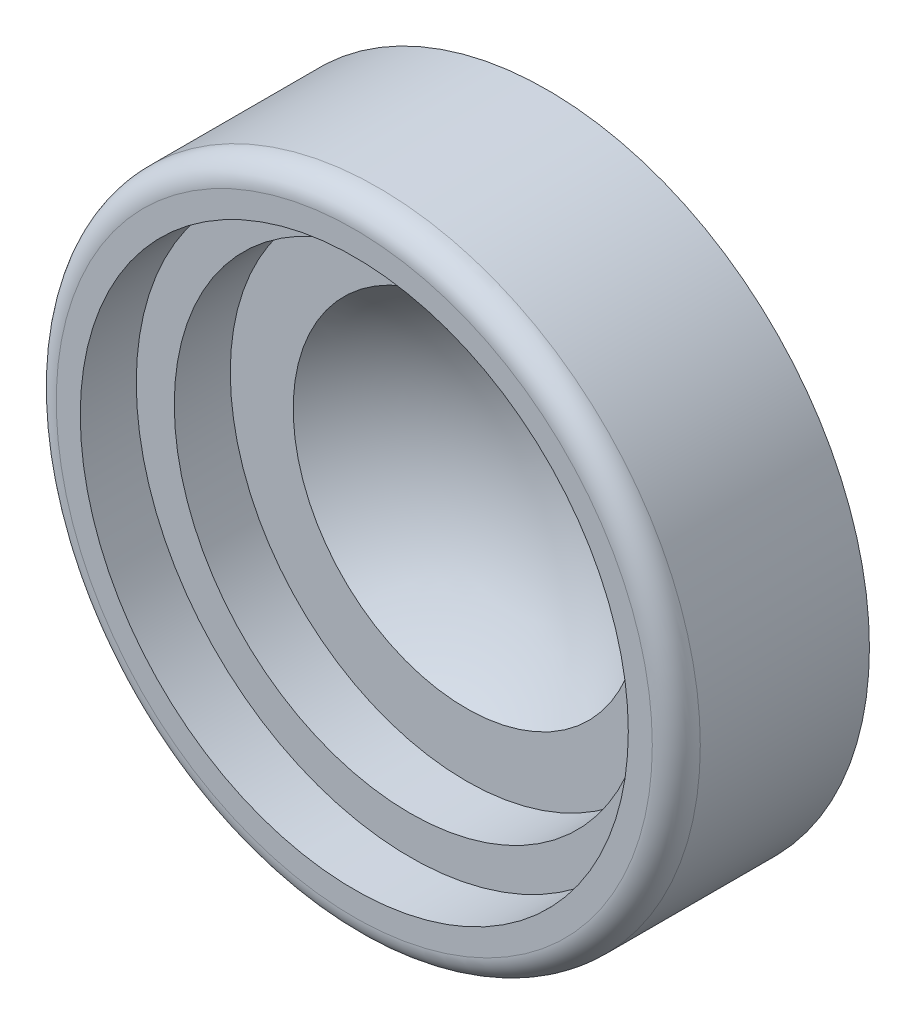
ISO-10303-21;
HEADER;
FILE_DESCRIPTION(('STEP AP214'),'2;1');
FILE_NAME('part.step','',(''),(''),'','','');
FILE_SCHEMA(('AUTOMOTIVE_DESIGN { 1 0 10303 214 1 1 1 1 }'));
ENDSEC;
DATA;
#1=APPLICATION_CONTEXT('core data for automotive mechanical design processes');
#2=APPLICATION_PROTOCOL_DEFINITION('international standard','automotive_design',2000,#1);
#3=PRODUCT_CONTEXT('',#1,'mechanical');
#4=PRODUCT('Part','Part','',(#3));
#5=PRODUCT_RELATED_PRODUCT_CATEGORY('part','',(#4));
#6=PRODUCT_DEFINITION_FORMATION('','',#4);
#7=PRODUCT_DEFINITION_CONTEXT('part definition',#1,'design');
#8=PRODUCT_DEFINITION('design','',#6,#7);
#9=PRODUCT_DEFINITION_SHAPE('','',#8);
#10=(LENGTH_UNIT() NAMED_UNIT(*) SI_UNIT(.MILLI.,.METRE.));
#11=(NAMED_UNIT(*) PLANE_ANGLE_UNIT() SI_UNIT($,.RADIAN.));
#12=(NAMED_UNIT(*) SI_UNIT($,.STERADIAN.) SOLID_ANGLE_UNIT());
#13=UNCERTAINTY_MEASURE_WITH_UNIT(LENGTH_MEASURE(1.E-05),#10,'distance_accuracy_value','');
#14=(GEOMETRIC_REPRESENTATION_CONTEXT(3) GLOBAL_UNCERTAINTY_ASSIGNED_CONTEXT((#13)) GLOBAL_UNIT_ASSIGNED_CONTEXT((#10,
#11,#12)) REPRESENTATION_CONTEXT('',''));
#15=CARTESIAN_POINT('',(0.,0.,0.));
#16=DIRECTION('',(0.,0.,1.));
#17=DIRECTION('',(1.,0.,0.));
#18=AXIS2_PLACEMENT_3D('',#15,#16,#17);
#19=CARTESIAN_POINT('',(0.,0.,28.250694444444));
#20=DIRECTION('',(0.,0.,1.));
#21=DIRECTION('',(1.,0.,0.));
#22=AXIS2_PLACEMENT_3D('',#19,#20,#21);
#23=SPHERICAL_SURFACE('',#22,3.050694444444);
#24=CARTESIAN_POINT('',(0.,0.,28.250694444444));
#25=DIRECTION('',(0.,-1.,0.));
#26=DIRECTION('',(1.,0.,0.));
#27=AXIS2_PLACEMENT_3D('',#24,#25,#26);
#28=CIRCLE('',#27,3.050694444444);
#29=CARTESIAN_POINT('',(0.,0.,25.2));
#30=VERTEX_POINT('',#29);
#31=CARTESIAN_POINT('',(2.163619652342,0.,26.1));
#32=VERTEX_POINT('',#31);
#33=EDGE_CURVE('E10',#30,#32,#28,.T.);
#34=ORIENTED_EDGE('',*,*,#33,.F.);
#35=ORIENTED_EDGE('',*,*,#33,.T.);
#36=CARTESIAN_POINT('',(0.,0.,26.1));
#37=DIRECTION('',(0.,0.,1.));
#38=DIRECTION('',(1.,0.,0.));
#39=AXIS2_PLACEMENT_3D('',#36,#37,#38);
#40=CIRCLE('',#39,2.163619652342);
#41=EDGE_CURVE('E19',#32,#32,#40,.T.);
#42=ORIENTED_EDGE('',*,*,#41,.T.);
#43=EDGE_LOOP('',(#34,#35,#42));
#44=FACE_BOUND('',#43,.T.);
#45=ADVANCED_FACE('F15',(#44),#23,.F.);
#46=CARTESIAN_POINT('',(0.,0.,26.1));
#47=DIRECTION('',(0.,0.,1.));
#48=DIRECTION('',(1.,0.,0.));
#49=AXIS2_PLACEMENT_3D('',#46,#47,#48);
#50=PLANE('',#49);
#51=ORIENTED_EDGE('',*,*,#41,.F.);
#52=EDGE_LOOP('',(#51));
#53=FACE_BOUND('',#52,.T.);
#54=CARTESIAN_POINT('',(0.,0.,26.1));
#55=DIRECTION('',(0.,0.,1.));
#56=DIRECTION('',(1.,0.,0.));
#57=AXIS2_PLACEMENT_3D('',#54,#55,#56);
#58=CIRCLE('',#57,2.95);
#59=CARTESIAN_POINT('',(2.95,0.,26.1));
#60=VERTEX_POINT('',#59);
#61=EDGE_CURVE('E68',#60,#60,#58,.T.);
#62=ORIENTED_EDGE('',*,*,#61,.T.);
#63=EDGE_LOOP('',(#62));
#64=FACE_BOUND('',#63,.T.);
#65=ADVANCED_FACE('F69',(#53,#64),#50,.T.);
#66=CARTESIAN_POINT('',(0.,0.,26.1));
#67=DIRECTION('',(0.,0.,1.));
#68=DIRECTION('',(1.,0.,0.));
#69=AXIS2_PLACEMENT_3D('',#66,#67,#68);
#70=CYLINDRICAL_SURFACE('',#69,2.95);
#71=DIRECTION('',(0.,0.,1.));
#72=VECTOR('',#71,1.);
#73=CARTESIAN_POINT('',(2.95,0.,26.1));
#74=LINE('',#73,#72);
#75=CARTESIAN_POINT('',(2.95,0.,26.8));
#76=VERTEX_POINT('',#75);
#77=EDGE_CURVE('E73',#60,#76,#74,.T.);
#78=ORIENTED_EDGE('',*,*,#77,.F.);
#79=ORIENTED_EDGE('',*,*,#61,.F.);
#80=ORIENTED_EDGE('',*,*,#77,.T.);
#81=CARTESIAN_POINT('',(0.,0.,26.8));
#82=DIRECTION('',(0.,0.,1.));
#83=DIRECTION('',(1.,0.,0.));
#84=AXIS2_PLACEMENT_3D('',#81,#82,#83);
#85=CIRCLE('',#84,2.95);
#86=EDGE_CURVE('E77',#76,#76,#85,.T.);
#87=ORIENTED_EDGE('',*,*,#86,.T.);
#88=EDGE_LOOP('',(#78,#79,#80,#87));
#89=FACE_BOUND('',#88,.T.);
#90=ADVANCED_FACE('F147',(#89),#70,.F.);
#91=CARTESIAN_POINT('',(0.,0.,26.8));
#92=DIRECTION('',(0.,0.,1.));
#93=DIRECTION('',(1.,0.,0.));
#94=AXIS2_PLACEMENT_3D('',#91,#92,#93);
#95=PLANE('',#94);
#96=ORIENTED_EDGE('',*,*,#86,.F.);
#97=EDGE_LOOP('',(#96));
#98=FACE_BOUND('',#97,.T.);
#99=CARTESIAN_POINT('',(0.,0.,26.8));
#100=DIRECTION('',(0.,0.,1.));
#101=DIRECTION('',(1.,0.,0.));
#102=AXIS2_PLACEMENT_3D('',#99,#100,#101);
#103=CIRCLE('',#102,3.425);
#104=CARTESIAN_POINT('',(3.425,0.,26.8));
#105=VERTEX_POINT('',#104);
#106=EDGE_CURVE('E83',#105,#105,#103,.T.);
#107=ORIENTED_EDGE('',*,*,#106,.T.);
#108=EDGE_LOOP('',(#107));
#109=FACE_BOUND('',#108,.T.);
#110=ADVANCED_FACE('F17',(#98,#109),#95,.T.);
#111=CARTESIAN_POINT('',(0.,0.,26.8));
#112=DIRECTION('',(0.,0.,1.));
#113=DIRECTION('',(1.,0.,0.));
#114=AXIS2_PLACEMENT_3D('',#111,#112,#113);
#115=CYLINDRICAL_SURFACE('',#114,3.425);
#116=DIRECTION('',(0.,0.,1.));
#117=VECTOR('',#116,1.);
#118=CARTESIAN_POINT('',(3.425,0.,26.8));
#119=LINE('',#118,#117);
#120=CARTESIAN_POINT('',(3.425,0.,27.5));
#121=VERTEX_POINT('',#120);
#122=EDGE_CURVE('E92',#105,#121,#119,.T.);
#123=ORIENTED_EDGE('',*,*,#122,.F.);
#124=ORIENTED_EDGE('',*,*,#106,.F.);
#125=ORIENTED_EDGE('',*,*,#122,.T.);
#126=CARTESIAN_POINT('',(0.,0.,27.5));
#127=DIRECTION('',(0.,0.,1.));
#128=DIRECTION('',(1.,0.,0.));
#129=AXIS2_PLACEMENT_3D('',#126,#127,#128);
#130=CIRCLE('',#129,3.425);
#131=EDGE_CURVE('E93',#121,#121,#130,.T.);
#132=ORIENTED_EDGE('',*,*,#131,.T.);
#133=EDGE_LOOP('',(#123,#124,#125,#132));
#134=FACE_BOUND('',#133,.T.);
#135=ADVANCED_FACE('F129',(#134),#115,.F.);
#136=CARTESIAN_POINT('',(0.,0.,27.5));
#137=DIRECTION('',(0.,0.,1.));
#138=DIRECTION('',(1.,0.,0.));
#139=AXIS2_PLACEMENT_3D('',#136,#137,#138);
#140=PLANE('',#139);
#141=ORIENTED_EDGE('',*,*,#131,.F.);
#142=EDGE_LOOP('',(#141));
#143=FACE_BOUND('',#142,.T.);
#144=CARTESIAN_POINT('',(0.,0.,27.5));
#145=DIRECTION('',(0.,0.,1.));
#146=DIRECTION('',(1.,0.,0.));
#147=AXIS2_PLACEMENT_3D('',#144,#145,#146);
#148=CIRCLE('',#147,3.725);
#149=CARTESIAN_POINT('',(3.725,0.,27.5));
#150=VERTEX_POINT('',#149);
#151=EDGE_CURVE('E103',#150,#150,#148,.T.);
#152=ORIENTED_EDGE('',*,*,#151,.T.);
#153=EDGE_LOOP('',(#152));
#154=FACE_BOUND('',#153,.T.);
#155=ADVANCED_FACE('F127',(#143,#154),#140,.T.);
#156=CARTESIAN_POINT('',(0.,0.,32.));
#157=DIRECTION('',(0.,0.,1.));
#158=DIRECTION('',(1.,0.,0.));
#159=AXIS2_PLACEMENT_3D('',#156,#157,#158);
#160=SPHERICAL_SURFACE('',#159,8.);
#161=CARTESIAN_POINT('',(0.,0.,25.086290792925));
#162=DIRECTION('',(0.,0.,1.));
#163=DIRECTION('',(0.,-1.,0.));
#164=AXIS2_PLACEMENT_3D('',#161,#162,#163);
#165=CIRCLE('',#164,4.025);
#166=CARTESIAN_POINT('',(4.025,0.,25.086290792925));
#167=VERTEX_POINT('',#166);
#168=EDGE_CURVE('E98',#167,#167,#165,.T.);
#169=ORIENTED_EDGE('',*,*,#168,.F.);
#170=CARTESIAN_POINT('',(0.,0.,32.));
#171=DIRECTION('',(0.,-1.,0.));
#172=DIRECTION('',(1.,0.,0.));
#173=AXIS2_PLACEMENT_3D('',#170,#171,#172);
#174=CIRCLE('',#173,8.);
#175=CARTESIAN_POINT('',(0.,0.,24.));
#176=VERTEX_POINT('',#175);
#177=EDGE_CURVE('E97',#176,#167,#174,.T.);
#178=ORIENTED_EDGE('',*,*,#177,.F.);
#179=ORIENTED_EDGE('',*,*,#177,.T.);
#180=EDGE_LOOP('',(#169,#178,#179));
#181=FACE_BOUND('',#180,.T.);
#182=ADVANCED_FACE('F118',(#181),#160,.T.);
#183=CARTESIAN_POINT('',(0.,0.,27.2));
#184=DIRECTION('',(0.,0.,1.));
#185=DIRECTION('',(1.,0.,0.));
#186=AXIS2_PLACEMENT_3D('',#183,#184,#185);
#187=TOROIDAL_SURFACE('',#186,3.725,0.3);
#188=CARTESIAN_POINT('',(3.725,0.,27.2));
#189=DIRECTION('',(0.,-1.,0.));
#190=DIRECTION('',(1.,0.,0.));
#191=AXIS2_PLACEMENT_3D('',#188,#189,#190);
#192=CIRCLE('',#191,0.3);
#193=CARTESIAN_POINT('',(4.025,0.,27.2));
#194=VERTEX_POINT('',#193);
#195=EDGE_CURVE('E102',#194,#150,#192,.T.);
#196=ORIENTED_EDGE('',*,*,#195,.F.);
#197=CARTESIAN_POINT('',(0.,0.,27.2));
#198=DIRECTION('',(0.,0.,1.));
#199=DIRECTION('',(1.,0.,0.));
#200=AXIS2_PLACEMENT_3D('',#197,#198,#199);
#201=CIRCLE('',#200,4.025);
#202=EDGE_CURVE('E88',#194,#194,#201,.T.);
#203=ORIENTED_EDGE('',*,*,#202,.T.);
#204=ORIENTED_EDGE('',*,*,#195,.T.);
#205=ORIENTED_EDGE('',*,*,#151,.F.);
#206=EDGE_LOOP('',(#196,#203,#204,#205));
#207=FACE_BOUND('',#206,.T.);
#208=ADVANCED_FACE('F124',(#207),#187,.T.);
#209=CARTESIAN_POINT('',(0.,0.,24.));
#210=DIRECTION('',(0.,0.,1.));
#211=DIRECTION('',(1.,0.,0.));
#212=AXIS2_PLACEMENT_3D('',#209,#210,#211);
#213=CYLINDRICAL_SURFACE('',#212,4.025);
#214=DIRECTION('',(0.,0.,1.));
#215=VECTOR('',#214,1.);
#216=CARTESIAN_POINT('',(4.025,0.,24.));
#217=LINE('',#216,#215);
#218=EDGE_CURVE('E84',#167,#194,#217,.T.);
#219=ORIENTED_EDGE('',*,*,#218,.T.);
#220=ORIENTED_EDGE('',*,*,#202,.F.);
#221=ORIENTED_EDGE('',*,*,#218,.F.);
#222=ORIENTED_EDGE('',*,*,#168,.T.);
#223=EDGE_LOOP('',(#219,#220,#221,#222));
#224=FACE_BOUND('',#223,.T.);
#225=ADVANCED_FACE('F121',(#224),#213,.T.);
#226=CLOSED_SHELL('',(#45,#65,#90,#110,#135,#155,#182,#208,#225));
#227=MANIFOLD_SOLID_BREP('B1',#226);
#228=ADVANCED_BREP_SHAPE_REPRESENTATION('',(#18,#227),#14);
#229=SHAPE_DEFINITION_REPRESENTATION(#9,#228);
ENDSEC;
END-ISO-10303-21;
